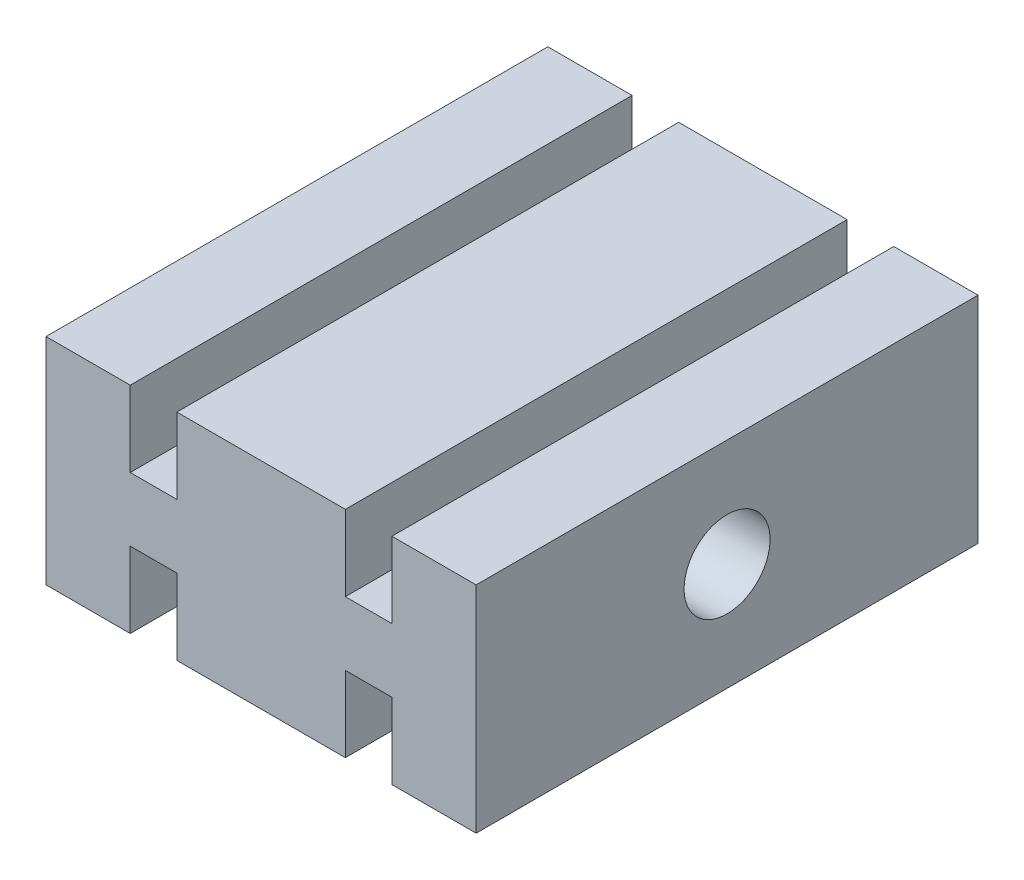
ISO-10303-21;
HEADER;
FILE_DESCRIPTION(('STEP AP214'),'2;1');
FILE_NAME('part.step','',(''),(''),'','','');
FILE_SCHEMA(('AUTOMOTIVE_DESIGN { 1 0 10303 214 1 1 1 1 }'));
ENDSEC;
DATA;
#1=APPLICATION_CONTEXT('core data for automotive mechanical design processes');
#2=APPLICATION_PROTOCOL_DEFINITION('international standard','automotive_design',2000,#1);
#3=PRODUCT_CONTEXT('',#1,'mechanical');
#4=PRODUCT('Part','Part','',(#3));
#5=PRODUCT_RELATED_PRODUCT_CATEGORY('part','',(#4));
#6=PRODUCT_DEFINITION_FORMATION('','',#4);
#7=PRODUCT_DEFINITION_CONTEXT('part definition',#1,'design');
#8=PRODUCT_DEFINITION('design','',#6,#7);
#9=PRODUCT_DEFINITION_SHAPE('','',#8);
#10=(LENGTH_UNIT() NAMED_UNIT(*) SI_UNIT(.MILLI.,.METRE.));
#11=(NAMED_UNIT(*) PLANE_ANGLE_UNIT() SI_UNIT($,.RADIAN.));
#12=(NAMED_UNIT(*) SI_UNIT($,.STERADIAN.) SOLID_ANGLE_UNIT());
#13=UNCERTAINTY_MEASURE_WITH_UNIT(LENGTH_MEASURE(1.E-05),#10,'distance_accuracy_value','');
#14=(GEOMETRIC_REPRESENTATION_CONTEXT(3) GLOBAL_UNCERTAINTY_ASSIGNED_CONTEXT((#13)) GLOBAL_UNIT_ASSIGNED_CONTEXT((#10,
#11,#12)) REPRESENTATION_CONTEXT('',''));
#15=CARTESIAN_POINT('',(0.,0.,0.));
#16=DIRECTION('',(0.,0.,1.));
#17=DIRECTION('',(1.,0.,0.));
#18=AXIS2_PLACEMENT_3D('',#15,#16,#17);
#19=CARTESIAN_POINT('',(11.75,4.45,-35.));
#20=DIRECTION('',(0.,-1.,0.));
#21=DIRECTION('',(0.,0.,-1.));
#22=AXIS2_PLACEMENT_3D('',#19,#20,#21);
#23=PLANE('',#22);
#24=DIRECTION('',(0.,0.,1.));
#25=VECTOR('',#24,1.);
#26=CARTESIAN_POINT('',(18.25,4.45,-35.));
#27=LINE('',#26,#25);
#28=CARTESIAN_POINT('',(18.25,4.45,4.02461178252015));
#29=VERTEX_POINT('',#28);
#30=CARTESIAN_POINT('',(18.25,4.45,35.));
#31=VERTEX_POINT('',#30);
#32=EDGE_CURVE('E301',#29,#31,#27,.T.);
#33=ORIENTED_EDGE('',*,*,#32,.F.);
#34=DIRECTION('',(-1.,0.,0.));
#35=VECTOR('',#34,1.);
#36=CARTESIAN_POINT('',(30.,4.45,4.02461178252015));
#37=LINE('',#36,#35);
#38=CARTESIAN_POINT('',(11.75,4.45,4.02461178252015));
#39=VERTEX_POINT('',#38);
#40=EDGE_CURVE('E390',#29,#39,#37,.T.);
#41=ORIENTED_EDGE('',*,*,#40,.T.);
#42=DIRECTION('',(0.,0.,1.));
#43=VECTOR('',#42,1.);
#44=CARTESIAN_POINT('',(11.75,4.45,-35.));
#45=LINE('',#44,#43);
#46=CARTESIAN_POINT('',(11.75,4.45,35.));
#47=VERTEX_POINT('',#46);
#48=EDGE_CURVE('E288',#39,#47,#45,.T.);
#49=ORIENTED_EDGE('',*,*,#48,.T.);
#50=DIRECTION('',(1.,0.,0.));
#51=VECTOR('',#50,1.);
#52=CARTESIAN_POINT('',(11.75,4.45,35.));
#53=LINE('',#52,#51);
#54=EDGE_CURVE('E268',#47,#31,#53,.T.);
#55=ORIENTED_EDGE('',*,*,#54,.T.);
#56=EDGE_LOOP('',(#33,#41,#49,#55));
#57=FACE_BOUND('',#56,.T.);
#58=ADVANCED_FACE('F39',(#57),#23,.F.);
#59=CARTESIAN_POINT('',(-18.25,4.45,-35.));
#60=DIRECTION('',(0.,-1.,0.));
#61=DIRECTION('',(0.,0.,-1.));
#62=AXIS2_PLACEMENT_3D('',#59,#60,#61);
#63=PLANE('',#62);
#64=DIRECTION('',(0.,0.,1.));
#65=VECTOR('',#64,1.);
#66=CARTESIAN_POINT('',(-11.75,4.45,-35.));
#67=LINE('',#66,#65);
#68=CARTESIAN_POINT('',(-11.75,4.45,4.02461178252015));
#69=VERTEX_POINT('',#68);
#70=CARTESIAN_POINT('',(-11.75,4.45,35.));
#71=VERTEX_POINT('',#70);
#72=EDGE_CURVE('E434',#69,#71,#67,.T.);
#73=ORIENTED_EDGE('',*,*,#72,.F.);
#74=DIRECTION('',(-1.,0.,0.));
#75=VECTOR('',#74,1.);
#76=CARTESIAN_POINT('',(30.,4.45,4.02461178252015));
#77=LINE('',#76,#75);
#78=CARTESIAN_POINT('',(-18.25,4.45,4.02461178252015));
#79=VERTEX_POINT('',#78);
#80=EDGE_CURVE('E377',#69,#79,#77,.T.);
#81=ORIENTED_EDGE('',*,*,#80,.T.);
#82=DIRECTION('',(0.,0.,1.));
#83=VECTOR('',#82,1.);
#84=CARTESIAN_POINT('',(-18.25,4.45,-35.));
#85=LINE('',#84,#83);
#86=CARTESIAN_POINT('',(-18.25,4.45,35.));
#87=VERTEX_POINT('',#86);
#88=EDGE_CURVE('E423',#79,#87,#85,.T.);
#89=ORIENTED_EDGE('',*,*,#88,.T.);
#90=DIRECTION('',(1.,0.,0.));
#91=VECTOR('',#90,1.);
#92=CARTESIAN_POINT('',(-18.25,4.45,35.));
#93=LINE('',#92,#91);
#94=EDGE_CURVE('E403',#87,#71,#93,.T.);
#95=ORIENTED_EDGE('',*,*,#94,.T.);
#96=EDGE_LOOP('',(#73,#81,#89,#95));
#97=FACE_BOUND('',#96,.T.);
#98=ADVANCED_FACE('F554',(#97),#63,.F.);
#99=CARTESIAN_POINT('',(-18.25,-4.45,-35.));
#100=DIRECTION('',(0.,1.,0.));
#101=DIRECTION('',(0.,0.,1.));
#102=AXIS2_PLACEMENT_3D('',#99,#100,#101);
#103=PLANE('',#102);
#104=DIRECTION('',(0.,0.,1.));
#105=VECTOR('',#104,1.);
#106=CARTESIAN_POINT('',(-11.75,-4.45,-35.));
#107=LINE('',#106,#105);
#108=CARTESIAN_POINT('',(-11.75,-4.45,-35.));
#109=VERTEX_POINT('',#108);
#110=CARTESIAN_POINT('',(-11.75,-4.45,-4.02461178252015));
#111=VERTEX_POINT('',#110);
#112=EDGE_CURVE('E467',#109,#111,#107,.T.);
#113=ORIENTED_EDGE('',*,*,#112,.T.);
#114=DIRECTION('',(-1.,0.,0.));
#115=VECTOR('',#114,1.);
#116=CARTESIAN_POINT('',(30.,-4.45,-4.02461178252015));
#117=LINE('',#116,#115);
#118=CARTESIAN_POINT('',(-18.25,-4.45,-4.02461178252015));
#119=VERTEX_POINT('',#118);
#120=EDGE_CURVE('E592',#111,#119,#117,.T.);
#121=ORIENTED_EDGE('',*,*,#120,.T.);
#122=DIRECTION('',(0.,0.,1.));
#123=VECTOR('',#122,1.);
#124=CARTESIAN_POINT('',(-18.25,-4.45,-35.));
#125=LINE('',#124,#123);
#126=CARTESIAN_POINT('',(-18.25,-4.45,-35.));
#127=VERTEX_POINT('',#126);
#128=EDGE_CURVE('E404',#127,#119,#125,.T.);
#129=ORIENTED_EDGE('',*,*,#128,.F.);
#130=DIRECTION('',(-1.,0.,0.));
#131=VECTOR('',#130,1.);
#132=CARTESIAN_POINT('',(-18.25,-4.45,-35.));
#133=LINE('',#132,#131);
#134=EDGE_CURVE('E458',#109,#127,#133,.T.);
#135=ORIENTED_EDGE('',*,*,#134,.F.);
#136=EDGE_LOOP('',(#113,#121,#129,#135));
#137=FACE_BOUND('',#136,.T.);
#138=ADVANCED_FACE('F578',(#137),#103,.F.);
#139=CARTESIAN_POINT('',(11.75,-4.45,-35.));
#140=DIRECTION('',(0.,1.,0.));
#141=DIRECTION('',(0.,0.,1.));
#142=AXIS2_PLACEMENT_3D('',#139,#140,#141);
#143=PLANE('',#142);
#144=DIRECTION('',(0.,0.,1.));
#145=VECTOR('',#144,1.);
#146=CARTESIAN_POINT('',(18.25,-4.45,-35.));
#147=LINE('',#146,#145);
#148=CARTESIAN_POINT('',(18.25,-4.45,-35.));
#149=VERTEX_POINT('',#148);
#150=CARTESIAN_POINT('',(18.25,-4.45,-4.02461178252015));
#151=VERTEX_POINT('',#150);
#152=EDGE_CURVE('E249',#149,#151,#147,.T.);
#153=ORIENTED_EDGE('',*,*,#152,.T.);
#154=DIRECTION('',(-1.,0.,0.));
#155=VECTOR('',#154,1.);
#156=CARTESIAN_POINT('',(30.,-4.45,-4.02461178252015));
#157=LINE('',#156,#155);
#158=CARTESIAN_POINT('',(11.75,-4.45,-4.02461178252015));
#159=VERTEX_POINT('',#158);
#160=EDGE_CURVE('E229',#151,#159,#157,.T.);
#161=ORIENTED_EDGE('',*,*,#160,.T.);
#162=DIRECTION('',(0.,0.,1.));
#163=VECTOR('',#162,1.);
#164=CARTESIAN_POINT('',(11.75,-4.45,-35.));
#165=LINE('',#164,#163);
#166=CARTESIAN_POINT('',(11.75,-4.45,-35.));
#167=VERTEX_POINT('',#166);
#168=EDGE_CURVE('E257',#167,#159,#165,.T.);
#169=ORIENTED_EDGE('',*,*,#168,.F.);
#170=DIRECTION('',(-1.,0.,0.));
#171=VECTOR('',#170,1.);
#172=CARTESIAN_POINT('',(11.75,-4.45,-35.));
#173=LINE('',#172,#171);
#174=EDGE_CURVE('E263',#149,#167,#173,.T.);
#175=ORIENTED_EDGE('',*,*,#174,.F.);
#176=EDGE_LOOP('',(#153,#161,#169,#175));
#177=FACE_BOUND('',#176,.T.);
#178=ADVANCED_FACE('F496',(#177),#143,.F.);
#179=CARTESIAN_POINT('',(-30.,15.,35.));
#180=DIRECTION('',(0.,-1.,0.));
#181=DIRECTION('',(0.,0.,-1.));
#182=AXIS2_PLACEMENT_3D('',#179,#180,#181);
#183=PLANE('',#182);
#184=DIRECTION('',(-1.,0.,0.));
#185=VECTOR('',#184,1.);
#186=CARTESIAN_POINT('',(-30.,15.,35.));
#187=LINE('',#186,#185);
#188=CARTESIAN_POINT('',(-18.25,15.,35.));
#189=VERTEX_POINT('',#188);
#190=CARTESIAN_POINT('',(-30.,15.,35.));
#191=VERTEX_POINT('',#190);
#192=EDGE_CURVE('E310',#189,#191,#187,.T.);
#193=ORIENTED_EDGE('',*,*,#192,.F.);
#194=DIRECTION('',(0.,0.,1.));
#195=VECTOR('',#194,1.);
#196=CARTESIAN_POINT('',(-18.25,15.,-35.));
#197=LINE('',#196,#195);
#198=CARTESIAN_POINT('',(-18.25,15.,-35.));
#199=VERTEX_POINT('',#198);
#200=EDGE_CURVE('E269',#199,#189,#197,.T.);
#201=ORIENTED_EDGE('',*,*,#200,.F.);
#202=DIRECTION('',(-1.,0.,0.));
#203=VECTOR('',#202,1.);
#204=CARTESIAN_POINT('',(-30.,15.,-35.));
#205=LINE('',#204,#203);
#206=CARTESIAN_POINT('',(-30.,15.,-35.));
#207=VERTEX_POINT('',#206);
#208=EDGE_CURVE('E330',#199,#207,#205,.T.);
#209=ORIENTED_EDGE('',*,*,#208,.T.);
#210=DIRECTION('',(0.,0.,-1.));
#211=VECTOR('',#210,1.);
#212=CARTESIAN_POINT('',(-30.,15.,35.));
#213=LINE('',#212,#211);
#214=EDGE_CURVE('E351',#191,#207,#213,.T.);
#215=ORIENTED_EDGE('',*,*,#214,.F.);
#216=EDGE_LOOP('',(#193,#201,#209,#215));
#217=FACE_BOUND('',#216,.T.);
#218=ADVANCED_FACE('F562',(#217),#183,.F.);
#219=CARTESIAN_POINT('',(11.75,15.,-35.));
#220=VERTEX_POINT('',#219);
#221=CARTESIAN_POINT('',(-11.75,15.,-35.));
#222=VERTEX_POINT('',#221);
#223=EDGE_CURVE('E336',#220,#222,#205,.T.);
#224=ORIENTED_EDGE('',*,*,#223,.T.);
#225=DIRECTION('',(0.,0.,1.));
#226=VECTOR('',#225,1.);
#227=CARTESIAN_POINT('',(-11.75,15.,-35.));
#228=LINE('',#227,#226);
#229=CARTESIAN_POINT('',(-11.75,15.,35.));
#230=VERTEX_POINT('',#229);
#231=EDGE_CURVE('E426',#222,#230,#228,.T.);
#232=ORIENTED_EDGE('',*,*,#231,.T.);
#233=CARTESIAN_POINT('',(11.75,15.,35.));
#234=VERTEX_POINT('',#233);
#235=EDGE_CURVE('E317',#234,#230,#187,.T.);
#236=ORIENTED_EDGE('',*,*,#235,.F.);
#237=DIRECTION('',(0.,0.,1.));
#238=VECTOR('',#237,1.);
#239=CARTESIAN_POINT('',(11.75,15.,-35.));
#240=LINE('',#239,#238);
#241=EDGE_CURVE('E289',#220,#234,#240,.T.);
#242=ORIENTED_EDGE('',*,*,#241,.F.);
#243=EDGE_LOOP('',(#224,#232,#236,#242));
#244=FACE_BOUND('',#243,.T.);
#245=ADVANCED_FACE('F540',(#244),#183,.F.);
#246=CARTESIAN_POINT('',(-30.,-15.,35.));
#247=DIRECTION('',(0.,1.,0.));
#248=DIRECTION('',(0.,0.,1.));
#249=AXIS2_PLACEMENT_3D('',#246,#247,#248);
#250=PLANE('',#249);
#251=DIRECTION('',(1.,0.,0.));
#252=VECTOR('',#251,1.);
#253=CARTESIAN_POINT('',(-30.,-15.,-35.));
#254=LINE('',#253,#252);
#255=CARTESIAN_POINT('',(-11.75,-15.,-35.));
#256=VERTEX_POINT('',#255);
#257=CARTESIAN_POINT('',(11.75,-15.,-35.));
#258=VERTEX_POINT('',#257);
#259=EDGE_CURVE('E343',#256,#258,#254,.T.);
#260=ORIENTED_EDGE('',*,*,#259,.T.);
#261=DIRECTION('',(0.,0.,1.));
#262=VECTOR('',#261,1.);
#263=CARTESIAN_POINT('',(11.75,-15.,-35.));
#264=LINE('',#263,#262);
#265=CARTESIAN_POINT('',(11.75,-15.,35.));
#266=VERTEX_POINT('',#265);
#267=EDGE_CURVE('E254',#258,#266,#264,.T.);
#268=ORIENTED_EDGE('',*,*,#267,.T.);
#269=DIRECTION('',(1.,0.,0.));
#270=VECTOR('',#269,1.);
#271=CARTESIAN_POINT('',(-30.,-15.,35.));
#272=LINE('',#271,#270);
#273=CARTESIAN_POINT('',(-11.75,-15.,35.));
#274=VERTEX_POINT('',#273);
#275=EDGE_CURVE('E326',#274,#266,#272,.T.);
#276=ORIENTED_EDGE('',*,*,#275,.F.);
#277=DIRECTION('',(0.,0.,1.));
#278=VECTOR('',#277,1.);
#279=CARTESIAN_POINT('',(-11.75,-15.,-35.));
#280=LINE('',#279,#278);
#281=EDGE_CURVE('E472',#256,#274,#280,.T.);
#282=ORIENTED_EDGE('',*,*,#281,.F.);
#283=EDGE_LOOP('',(#260,#268,#276,#282));
#284=FACE_BOUND('',#283,.T.);
#285=ADVANCED_FACE('F513',(#284),#250,.F.);
#286=CARTESIAN_POINT('',(-30.,-15.,-35.));
#287=VERTEX_POINT('',#286);
#288=CARTESIAN_POINT('',(-18.25,-15.,-35.));
#289=VERTEX_POINT('',#288);
#290=EDGE_CURVE('E311',#287,#289,#254,.T.);
#291=ORIENTED_EDGE('',*,*,#290,.T.);
#292=DIRECTION('',(0.,0.,1.));
#293=VECTOR('',#292,1.);
#294=CARTESIAN_POINT('',(-18.25,-15.,-35.));
#295=LINE('',#294,#293);
#296=CARTESIAN_POINT('',(-18.25,-15.,35.));
#297=VERTEX_POINT('',#296);
#298=EDGE_CURVE('E462',#289,#297,#295,.T.);
#299=ORIENTED_EDGE('',*,*,#298,.T.);
#300=CARTESIAN_POINT('',(-30.,-15.,35.));
#301=VERTEX_POINT('',#300);
#302=EDGE_CURVE('E321',#301,#297,#272,.T.);
#303=ORIENTED_EDGE('',*,*,#302,.F.);
#304=DIRECTION('',(0.,0.,-1.));
#305=VECTOR('',#304,1.);
#306=CARTESIAN_POINT('',(-30.,-15.,35.));
#307=LINE('',#306,#305);
#308=EDGE_CURVE('E347',#301,#287,#307,.T.);
#309=ORIENTED_EDGE('',*,*,#308,.T.);
#310=EDGE_LOOP('',(#291,#299,#303,#309));
#311=FACE_BOUND('',#310,.T.);
#312=ADVANCED_FACE('F571',(#311),#250,.F.);
#313=CARTESIAN_POINT('',(30.,-15.,35.));
#314=DIRECTION('',(-1.,0.,0.));
#315=DIRECTION('',(0.,0.,1.));
#316=AXIS2_PLACEMENT_3D('',#313,#314,#315);
#317=PLANE('',#316);
#318=CARTESIAN_POINT('',(30.,0.,0.));
#319=DIRECTION('',(-1.,0.,0.));
#320=DIRECTION('',(0.,0.,1.));
#321=AXIS2_PLACEMENT_3D('',#318,#319,#320);
#322=CIRCLE('',#321,6.);
#323=CARTESIAN_POINT('',(30.,0.,6.));
#324=VERTEX_POINT('',#323);
#325=EDGE_CURVE('E242',#324,#324,#322,.T.);
#326=ORIENTED_EDGE('',*,*,#325,.T.);
#327=EDGE_LOOP('',(#326));
#328=FACE_BOUND('',#327,.T.);
#329=DIRECTION('',(0.,1.,0.));
#330=VECTOR('',#329,1.);
#331=CARTESIAN_POINT('',(30.,-15.,-35.));
#332=LINE('',#331,#330);
#333=CARTESIAN_POINT('',(30.,-15.,-35.));
#334=VERTEX_POINT('',#333);
#335=CARTESIAN_POINT('',(30.,15.,-35.));
#336=VERTEX_POINT('',#335);
#337=EDGE_CURVE('E292',#334,#336,#332,.T.);
#338=ORIENTED_EDGE('',*,*,#337,.T.);
#339=DIRECTION('',(0.,0.,-1.));
#340=VECTOR('',#339,1.);
#341=CARTESIAN_POINT('',(30.,15.,35.));
#342=LINE('',#341,#340);
#343=CARTESIAN_POINT('',(30.,15.,35.));
#344=VERTEX_POINT('',#343);
#345=EDGE_CURVE('E48',#344,#336,#342,.T.);
#346=ORIENTED_EDGE('',*,*,#345,.F.);
#347=DIRECTION('',(0.,1.,0.));
#348=VECTOR('',#347,1.);
#349=CARTESIAN_POINT('',(30.,-15.,35.));
#350=LINE('',#349,#348);
#351=CARTESIAN_POINT('',(30.,-15.,35.));
#352=VERTEX_POINT('',#351);
#353=EDGE_CURVE('E306',#352,#344,#350,.T.);
#354=ORIENTED_EDGE('',*,*,#353,.F.);
#355=DIRECTION('',(0.,0.,-1.));
#356=VECTOR('',#355,1.);
#357=CARTESIAN_POINT('',(30.,-15.,35.));
#358=LINE('',#357,#356);
#359=EDGE_CURVE('E325',#352,#334,#358,.T.);
#360=ORIENTED_EDGE('',*,*,#359,.T.);
#361=EDGE_LOOP('',(#338,#346,#354,#360));
#362=FACE_BOUND('',#361,.T.);
#363=ADVANCED_FACE('F41',(#328,#362),#317,.F.);
#364=CARTESIAN_POINT('',(18.25,15.,-35.));
#365=VERTEX_POINT('',#364);
#366=EDGE_CURVE('E331',#336,#365,#205,.T.);
#367=ORIENTED_EDGE('',*,*,#366,.T.);
#368=DIRECTION('',(0.,0.,1.));
#369=VECTOR('',#368,1.);
#370=CARTESIAN_POINT('',(18.25,15.,-35.));
#371=LINE('',#370,#369);
#372=CARTESIAN_POINT('',(18.25,15.,35.));
#373=VERTEX_POINT('',#372);
#374=EDGE_CURVE('E293',#365,#373,#371,.T.);
#375=ORIENTED_EDGE('',*,*,#374,.T.);
#376=EDGE_CURVE('E312',#344,#373,#187,.T.);
#377=ORIENTED_EDGE('',*,*,#376,.F.);
#378=ORIENTED_EDGE('',*,*,#345,.T.);
#379=EDGE_LOOP('',(#367,#375,#377,#378));
#380=FACE_BOUND('',#379,.T.);
#381=ADVANCED_FACE('F358',(#380),#183,.F.);
#382=CARTESIAN_POINT('',(-30.,-15.,35.));
#383=DIRECTION('',(1.,0.,0.));
#384=DIRECTION('',(0.,0.,-1.));
#385=AXIS2_PLACEMENT_3D('',#382,#383,#384);
#386=PLANE('',#385);
#387=CARTESIAN_POINT('',(-30.,0.,0.));
#388=DIRECTION('',(1.,0.,0.));
#389=DIRECTION('',(0.,0.,-1.));
#390=AXIS2_PLACEMENT_3D('',#387,#388,#389);
#391=CIRCLE('',#390,6.);
#392=CARTESIAN_POINT('',(-30.,0.,-6.));
#393=VERTEX_POINT('',#392);
#394=EDGE_CURVE('E394',#393,#393,#391,.T.);
#395=ORIENTED_EDGE('',*,*,#394,.T.);
#396=EDGE_LOOP('',(#395));
#397=FACE_BOUND('',#396,.T.);
#398=DIRECTION('',(0.,-1.,0.));
#399=VECTOR('',#398,1.);
#400=CARTESIAN_POINT('',(-30.,-15.,-35.));
#401=LINE('',#400,#399);
#402=EDGE_CURVE('E335',#207,#287,#401,.T.);
#403=ORIENTED_EDGE('',*,*,#402,.T.);
#404=ORIENTED_EDGE('',*,*,#308,.F.);
#405=DIRECTION('',(0.,-1.,0.));
#406=VECTOR('',#405,1.);
#407=CARTESIAN_POINT('',(-30.,-15.,35.));
#408=LINE('',#407,#406);
#409=EDGE_CURVE('E316',#191,#301,#408,.T.);
#410=ORIENTED_EDGE('',*,*,#409,.F.);
#411=ORIENTED_EDGE('',*,*,#214,.T.);
#412=EDGE_LOOP('',(#403,#404,#410,#411));
#413=FACE_BOUND('',#412,.T.);
#414=ADVANCED_FACE('F567',(#397,#413),#386,.F.);
#415=CARTESIAN_POINT('',(18.25,-15.,35.));
#416=VERTEX_POINT('',#415);
#417=EDGE_CURVE('E320',#416,#352,#272,.T.);
#418=ORIENTED_EDGE('',*,*,#417,.F.);
#419=DIRECTION('',(0.,0.,1.));
#420=VECTOR('',#419,1.);
#421=CARTESIAN_POINT('',(18.25,-15.,-35.));
#422=LINE('',#421,#420);
#423=CARTESIAN_POINT('',(18.25,-15.,-35.));
#424=VERTEX_POINT('',#423);
#425=EDGE_CURVE('E250',#424,#416,#422,.T.);
#426=ORIENTED_EDGE('',*,*,#425,.F.);
#427=EDGE_CURVE('E339',#424,#334,#254,.T.);
#428=ORIENTED_EDGE('',*,*,#427,.T.);
#429=ORIENTED_EDGE('',*,*,#359,.F.);
#430=EDGE_LOOP('',(#418,#426,#428,#429));
#431=FACE_BOUND('',#430,.T.);
#432=ADVANCED_FACE('F501',(#431),#250,.F.);
#433=CARTESIAN_POINT('',(0.,0.,35.));
#434=DIRECTION('',(0.,0.,-1.));
#435=DIRECTION('',(-1.,0.,0.));
#436=AXIS2_PLACEMENT_3D('',#433,#434,#435);
#437=PLANE('',#436);
#438=ORIENTED_EDGE('',*,*,#275,.T.);
#439=DIRECTION('',(0.,-1.,0.));
#440=VECTOR('',#439,1.);
#441=CARTESIAN_POINT('',(11.75,-15.,35.));
#442=LINE('',#441,#440);
#443=CARTESIAN_POINT('',(11.75,-4.45,35.));
#444=VERTEX_POINT('',#443);
#445=EDGE_CURVE('E398',#444,#266,#442,.T.);
#446=ORIENTED_EDGE('',*,*,#445,.F.);
#447=DIRECTION('',(-1.,0.,0.));
#448=VECTOR('',#447,1.);
#449=CARTESIAN_POINT('',(11.75,-4.45,35.));
#450=LINE('',#449,#448);
#451=CARTESIAN_POINT('',(18.25,-4.45,35.));
#452=VERTEX_POINT('',#451);
#453=EDGE_CURVE('E482',#452,#444,#450,.T.);
#454=ORIENTED_EDGE('',*,*,#453,.F.);
#455=DIRECTION('',(0.,1.,0.));
#456=VECTOR('',#455,1.);
#457=CARTESIAN_POINT('',(18.25,-15.,35.));
#458=LINE('',#457,#456);
#459=EDGE_CURVE('E246',#416,#452,#458,.T.);
#460=ORIENTED_EDGE('',*,*,#459,.F.);
#461=ORIENTED_EDGE('',*,*,#417,.T.);
#462=ORIENTED_EDGE('',*,*,#353,.T.);
#463=ORIENTED_EDGE('',*,*,#376,.T.);
#464=DIRECTION('',(0.,1.,0.));
#465=VECTOR('',#464,1.);
#466=CARTESIAN_POINT('',(18.25,15.,35.));
#467=LINE('',#466,#465);
#468=EDGE_CURVE('E273',#31,#373,#467,.T.);
#469=ORIENTED_EDGE('',*,*,#468,.F.);
#470=ORIENTED_EDGE('',*,*,#54,.F.);
#471=DIRECTION('',(0.,-1.,0.));
#472=VECTOR('',#471,1.);
#473=CARTESIAN_POINT('',(11.75,15.,35.));
#474=LINE('',#473,#472);
#475=EDGE_CURVE('E264',#234,#47,#474,.T.);
#476=ORIENTED_EDGE('',*,*,#475,.F.);
#477=ORIENTED_EDGE('',*,*,#235,.T.);
#478=DIRECTION('',(0.,1.,0.));
#479=VECTOR('',#478,1.);
#480=CARTESIAN_POINT('',(-11.75,15.,35.));
#481=LINE('',#480,#479);
#482=EDGE_CURVE('E408',#71,#230,#481,.T.);
#483=ORIENTED_EDGE('',*,*,#482,.F.);
#484=ORIENTED_EDGE('',*,*,#94,.F.);
#485=DIRECTION('',(0.,-1.,0.));
#486=VECTOR('',#485,1.);
#487=CARTESIAN_POINT('',(-18.25,15.,35.));
#488=LINE('',#487,#486);
#489=EDGE_CURVE('E399',#189,#87,#488,.T.);
#490=ORIENTED_EDGE('',*,*,#489,.F.);
#491=ORIENTED_EDGE('',*,*,#192,.T.);
#492=ORIENTED_EDGE('',*,*,#409,.T.);
#493=ORIENTED_EDGE('',*,*,#302,.T.);
#494=DIRECTION('',(0.,-1.,0.));
#495=VECTOR('',#494,1.);
#496=CARTESIAN_POINT('',(-18.25,-15.,35.));
#497=LINE('',#496,#495);
#498=CARTESIAN_POINT('',(-18.25,-4.45,35.));
#499=VERTEX_POINT('',#498);
#500=EDGE_CURVE('E439',#499,#297,#497,.T.);
#501=ORIENTED_EDGE('',*,*,#500,.F.);
#502=DIRECTION('',(-1.,0.,0.));
#503=VECTOR('',#502,1.);
#504=CARTESIAN_POINT('',(-18.25,-4.45,35.));
#505=LINE('',#504,#503);
#506=CARTESIAN_POINT('',(-11.75,-4.45,35.));
#507=VERTEX_POINT('',#506);
#508=EDGE_CURVE('E446',#507,#499,#505,.T.);
#509=ORIENTED_EDGE('',*,*,#508,.F.);
#510=DIRECTION('',(0.,1.,0.));
#511=VECTOR('',#510,1.);
#512=CARTESIAN_POINT('',(-11.75,-15.,35.));
#513=LINE('',#512,#511);
#514=EDGE_CURVE('E442',#274,#507,#513,.T.);
#515=ORIENTED_EDGE('',*,*,#514,.F.);
#516=EDGE_LOOP('',(#438,#446,#454,#460,#461,#462,#463,#469,#470,#476,#477,#483,#484,#490,#491,
#492,#493,#501,#509,#515));
#517=FACE_BOUND('',#516,.T.);
#518=ADVANCED_FACE('F509',(#517),#437,.F.);
#519=CARTESIAN_POINT('',(0.,0.,-35.));
#520=DIRECTION('',(0.,0.,-1.));
#521=DIRECTION('',(-1.,0.,0.));
#522=AXIS2_PLACEMENT_3D('',#519,#520,#521);
#523=PLANE('',#522);
#524=DIRECTION('',(0.,-1.,0.));
#525=VECTOR('',#524,1.);
#526=CARTESIAN_POINT('',(11.75,-15.,-35.));
#527=LINE('',#526,#525);
#528=EDGE_CURVE('E485',#167,#258,#527,.T.);
#529=ORIENTED_EDGE('',*,*,#528,.T.);
#530=ORIENTED_EDGE('',*,*,#259,.F.);
#531=DIRECTION('',(0.,1.,0.));
#532=VECTOR('',#531,1.);
#533=CARTESIAN_POINT('',(-11.75,-15.,-35.));
#534=LINE('',#533,#532);
#535=EDGE_CURVE('E454',#256,#109,#534,.T.);
#536=ORIENTED_EDGE('',*,*,#535,.T.);
#537=ORIENTED_EDGE('',*,*,#134,.T.);
#538=DIRECTION('',(0.,-1.,0.));
#539=VECTOR('',#538,1.);
#540=CARTESIAN_POINT('',(-18.25,-15.,-35.));
#541=LINE('',#540,#539);
#542=EDGE_CURVE('E450',#127,#289,#541,.T.);
#543=ORIENTED_EDGE('',*,*,#542,.T.);
#544=ORIENTED_EDGE('',*,*,#290,.F.);
#545=ORIENTED_EDGE('',*,*,#402,.F.);
#546=ORIENTED_EDGE('',*,*,#208,.F.);
#547=DIRECTION('',(0.,-1.,0.));
#548=VECTOR('',#547,1.);
#549=CARTESIAN_POINT('',(-18.25,15.,-35.));
#550=LINE('',#549,#548);
#551=CARTESIAN_POINT('',(-18.25,4.45,-35.));
#552=VERTEX_POINT('',#551);
#553=EDGE_CURVE('E411',#199,#552,#550,.T.);
#554=ORIENTED_EDGE('',*,*,#553,.T.);
#555=DIRECTION('',(1.,0.,0.));
#556=VECTOR('',#555,1.);
#557=CARTESIAN_POINT('',(-18.25,4.45,-35.));
#558=LINE('',#557,#556);
#559=CARTESIAN_POINT('',(-11.75,4.45,-35.));
#560=VERTEX_POINT('',#559);
#561=EDGE_CURVE('E415',#552,#560,#558,.T.);
#562=ORIENTED_EDGE('',*,*,#561,.T.);
#563=DIRECTION('',(0.,1.,0.));
#564=VECTOR('',#563,1.);
#565=CARTESIAN_POINT('',(-11.75,15.,-35.));
#566=LINE('',#565,#564);
#567=EDGE_CURVE('E419',#560,#222,#566,.T.);
#568=ORIENTED_EDGE('',*,*,#567,.T.);
#569=ORIENTED_EDGE('',*,*,#223,.F.);
#570=DIRECTION('',(0.,-1.,0.));
#571=VECTOR('',#570,1.);
#572=CARTESIAN_POINT('',(11.75,15.,-35.));
#573=LINE('',#572,#571);
#574=CARTESIAN_POINT('',(11.75,4.45,-35.));
#575=VERTEX_POINT('',#574);
#576=EDGE_CURVE('E276',#220,#575,#573,.T.);
#577=ORIENTED_EDGE('',*,*,#576,.T.);
#578=DIRECTION('',(1.,0.,0.));
#579=VECTOR('',#578,1.);
#580=CARTESIAN_POINT('',(11.75,4.45,-35.));
#581=LINE('',#580,#579);
#582=CARTESIAN_POINT('',(18.25,4.45,-35.));
#583=VERTEX_POINT('',#582);
#584=EDGE_CURVE('E280',#575,#583,#581,.T.);
#585=ORIENTED_EDGE('',*,*,#584,.T.);
#586=DIRECTION('',(0.,1.,0.));
#587=VECTOR('',#586,1.);
#588=CARTESIAN_POINT('',(18.25,15.,-35.));
#589=LINE('',#588,#587);
#590=EDGE_CURVE('E284',#583,#365,#589,.T.);
#591=ORIENTED_EDGE('',*,*,#590,.T.);
#592=ORIENTED_EDGE('',*,*,#366,.F.);
#593=ORIENTED_EDGE('',*,*,#337,.F.);
#594=ORIENTED_EDGE('',*,*,#427,.F.);
#595=DIRECTION('',(0.,1.,0.));
#596=VECTOR('',#595,1.);
#597=CARTESIAN_POINT('',(18.25,-15.,-35.));
#598=LINE('',#597,#596);
#599=EDGE_CURVE('E488',#424,#149,#598,.T.);
#600=ORIENTED_EDGE('',*,*,#599,.T.);
#601=ORIENTED_EDGE('',*,*,#174,.T.);
#602=EDGE_LOOP('',(#529,#530,#536,#537,#543,#544,#545,#546,#554,#562,#568,#569,#577,#585,#591,
#592,#593,#594,#600,#601));
#603=FACE_BOUND('',#602,.T.);
#604=ADVANCED_FACE('F366',(#603),#523,.T.);
#605=CARTESIAN_POINT('',(11.75,15.,-35.));
#606=DIRECTION('',(-1.,0.,0.));
#607=DIRECTION('',(0.,0.,1.));
#608=AXIS2_PLACEMENT_3D('',#605,#606,#607);
#609=PLANE('',#608);
#610=ORIENTED_EDGE('',*,*,#48,.F.);
#611=CARTESIAN_POINT('',(11.75,0.,0.));
#612=DIRECTION('',(-1.,0.,0.));
#613=DIRECTION('',(0.,0.,1.));
#614=AXIS2_PLACEMENT_3D('',#611,#612,#613);
#615=CIRCLE('',#614,6.);
#616=CARTESIAN_POINT('',(11.75,4.45,-4.02461178252015));
#617=VERTEX_POINT('',#616);
#618=EDGE_CURVE('E381',#39,#617,#615,.T.);
#619=ORIENTED_EDGE('',*,*,#618,.T.);
#620=EDGE_CURVE('E302',#575,#617,#45,.T.);
#621=ORIENTED_EDGE('',*,*,#620,.F.);
#622=ORIENTED_EDGE('',*,*,#576,.F.);
#623=ORIENTED_EDGE('',*,*,#241,.T.);
#624=ORIENTED_EDGE('',*,*,#475,.T.);
#625=EDGE_LOOP('',(#610,#619,#621,#622,#623,#624));
#626=FACE_BOUND('',#625,.T.);
#627=ADVANCED_FACE('F637',(#626),#609,.F.);
#628=CARTESIAN_POINT('',(18.25,15.,-35.));
#629=DIRECTION('',(1.,0.,0.));
#630=DIRECTION('',(0.,0.,-1.));
#631=AXIS2_PLACEMENT_3D('',#628,#629,#630);
#632=PLANE('',#631);
#633=CARTESIAN_POINT('',(18.25,4.45,-4.02461178252015));
#634=VERTEX_POINT('',#633);
#635=EDGE_CURVE('E297',#583,#634,#27,.T.);
#636=ORIENTED_EDGE('',*,*,#635,.T.);
#637=CARTESIAN_POINT('',(18.25,0.,0.));
#638=DIRECTION('',(1.,0.,0.));
#639=DIRECTION('',(0.,0.,-1.));
#640=AXIS2_PLACEMENT_3D('',#637,#638,#639);
#641=CIRCLE('',#640,6.);
#642=EDGE_CURVE('E55',#634,#29,#641,.T.);
#643=ORIENTED_EDGE('',*,*,#642,.T.);
#644=ORIENTED_EDGE('',*,*,#32,.T.);
#645=ORIENTED_EDGE('',*,*,#468,.T.);
#646=ORIENTED_EDGE('',*,*,#374,.F.);
#647=ORIENTED_EDGE('',*,*,#590,.F.);
#648=EDGE_LOOP('',(#636,#643,#644,#645,#646,#647));
#649=FACE_BOUND('',#648,.T.);
#650=ADVANCED_FACE('F371',(#649),#632,.F.);
#651=ORIENTED_EDGE('',*,*,#620,.T.);
#652=DIRECTION('',(-1.,0.,0.));
#653=VECTOR('',#652,1.);
#654=CARTESIAN_POINT('',(30.,4.45,-4.02461178252015));
#655=LINE('',#654,#653);
#656=EDGE_CURVE('E374',#617,#634,#655,.F.);
#657=ORIENTED_EDGE('',*,*,#656,.T.);
#658=ORIENTED_EDGE('',*,*,#635,.F.);
#659=ORIENTED_EDGE('',*,*,#584,.F.);
#660=EDGE_LOOP('',(#651,#657,#658,#659));
#661=FACE_BOUND('',#660,.T.);
#662=ADVANCED_FACE('F373',(#661),#23,.F.);
#663=CARTESIAN_POINT('',(-18.25,15.,-35.));
#664=DIRECTION('',(-1.,0.,0.));
#665=DIRECTION('',(0.,0.,1.));
#666=AXIS2_PLACEMENT_3D('',#663,#664,#665);
#667=PLANE('',#666);
#668=ORIENTED_EDGE('',*,*,#88,.F.);
#669=CARTESIAN_POINT('',(-18.25,0.,0.));
#670=DIRECTION('',(-1.,0.,0.));
#671=DIRECTION('',(0.,0.,1.));
#672=AXIS2_PLACEMENT_3D('',#669,#670,#671);
#673=CIRCLE('',#672,6.);
#674=CARTESIAN_POINT('',(-18.25,4.45,-4.02461178252015));
#675=VERTEX_POINT('',#674);
#676=EDGE_CURVE('E384',#79,#675,#673,.T.);
#677=ORIENTED_EDGE('',*,*,#676,.T.);
#678=EDGE_CURVE('E435',#552,#675,#85,.T.);
#679=ORIENTED_EDGE('',*,*,#678,.F.);
#680=ORIENTED_EDGE('',*,*,#553,.F.);
#681=ORIENTED_EDGE('',*,*,#200,.T.);
#682=ORIENTED_EDGE('',*,*,#489,.T.);
#683=EDGE_LOOP('',(#668,#677,#679,#680,#681,#682));
#684=FACE_BOUND('',#683,.T.);
#685=ADVANCED_FACE('F606',(#684),#667,.F.);
#686=CARTESIAN_POINT('',(-11.75,15.,-35.));
#687=DIRECTION('',(1.,0.,0.));
#688=DIRECTION('',(0.,0.,-1.));
#689=AXIS2_PLACEMENT_3D('',#686,#687,#688);
#690=PLANE('',#689);
#691=CARTESIAN_POINT('',(-11.75,4.45,-4.02461178252015));
#692=VERTEX_POINT('',#691);
#693=EDGE_CURVE('E430',#560,#692,#67,.T.);
#694=ORIENTED_EDGE('',*,*,#693,.T.);
#695=CARTESIAN_POINT('',(-11.75,0.,0.));
#696=DIRECTION('',(1.,0.,0.));
#697=DIRECTION('',(0.,0.,-1.));
#698=AXIS2_PLACEMENT_3D('',#695,#696,#697);
#699=CIRCLE('',#698,6.);
#700=EDGE_CURVE('E63',#692,#69,#699,.T.);
#701=ORIENTED_EDGE('',*,*,#700,.T.);
#702=ORIENTED_EDGE('',*,*,#72,.T.);
#703=ORIENTED_EDGE('',*,*,#482,.T.);
#704=ORIENTED_EDGE('',*,*,#231,.F.);
#705=ORIENTED_EDGE('',*,*,#567,.F.);
#706=EDGE_LOOP('',(#694,#701,#702,#703,#704,#705));
#707=FACE_BOUND('',#706,.T.);
#708=ADVANCED_FACE('F543',(#707),#690,.F.);
#709=ORIENTED_EDGE('',*,*,#678,.T.);
#710=DIRECTION('',(-1.,0.,0.));
#711=VECTOR('',#710,1.);
#712=CARTESIAN_POINT('',(30.,4.45,-4.02461178252015));
#713=LINE('',#712,#711);
#714=EDGE_CURVE('E549',#675,#692,#713,.F.);
#715=ORIENTED_EDGE('',*,*,#714,.T.);
#716=ORIENTED_EDGE('',*,*,#693,.F.);
#717=ORIENTED_EDGE('',*,*,#561,.F.);
#718=EDGE_LOOP('',(#709,#715,#716,#717));
#719=FACE_BOUND('',#718,.T.);
#720=ADVANCED_FACE('F548',(#719),#63,.F.);
#721=CARTESIAN_POINT('',(-18.25,-15.,-35.));
#722=DIRECTION('',(-1.,0.,0.));
#723=DIRECTION('',(0.,0.,1.));
#724=AXIS2_PLACEMENT_3D('',#721,#722,#723);
#725=PLANE('',#724);
#726=ORIENTED_EDGE('',*,*,#128,.T.);
#727=CARTESIAN_POINT('',(-18.25,0.,0.));
#728=DIRECTION('',(-1.,0.,0.));
#729=DIRECTION('',(0.,0.,1.));
#730=AXIS2_PLACEMENT_3D('',#727,#728,#729);
#731=CIRCLE('',#730,6.);
#732=CARTESIAN_POINT('',(-18.25,-4.45,4.02461178252015));
#733=VERTEX_POINT('',#732);
#734=EDGE_CURVE('E599',#119,#733,#731,.T.);
#735=ORIENTED_EDGE('',*,*,#734,.T.);
#736=EDGE_CURVE('E466',#733,#499,#125,.T.);
#737=ORIENTED_EDGE('',*,*,#736,.T.);
#738=ORIENTED_EDGE('',*,*,#500,.T.);
#739=ORIENTED_EDGE('',*,*,#298,.F.);
#740=ORIENTED_EDGE('',*,*,#542,.F.);
#741=EDGE_LOOP('',(#726,#735,#737,#738,#739,#740));
#742=FACE_BOUND('',#741,.T.);
#743=ADVANCED_FACE('F575',(#742),#725,.F.);
#744=ORIENTED_EDGE('',*,*,#736,.F.);
#745=DIRECTION('',(-1.,0.,0.));
#746=VECTOR('',#745,1.);
#747=CARTESIAN_POINT('',(30.,-4.45,4.02461178252015));
#748=LINE('',#747,#746);
#749=CARTESIAN_POINT('',(-11.75,-4.45,4.02461178252015));
#750=VERTEX_POINT('',#749);
#751=EDGE_CURVE('E588',#733,#750,#748,.F.);
#752=ORIENTED_EDGE('',*,*,#751,.T.);
#753=EDGE_CURVE('E471',#750,#507,#107,.T.);
#754=ORIENTED_EDGE('',*,*,#753,.T.);
#755=ORIENTED_EDGE('',*,*,#508,.T.);
#756=EDGE_LOOP('',(#744,#752,#754,#755));
#757=FACE_BOUND('',#756,.T.);
#758=ADVANCED_FACE('F611',(#757),#103,.F.);
#759=CARTESIAN_POINT('',(-11.75,-15.,-35.));
#760=DIRECTION('',(1.,0.,0.));
#761=DIRECTION('',(0.,0.,-1.));
#762=AXIS2_PLACEMENT_3D('',#759,#760,#761);
#763=PLANE('',#762);
#764=ORIENTED_EDGE('',*,*,#753,.F.);
#765=CARTESIAN_POINT('',(-11.75,0.,0.));
#766=DIRECTION('',(1.,0.,0.));
#767=DIRECTION('',(0.,0.,-1.));
#768=AXIS2_PLACEMENT_3D('',#765,#766,#767);
#769=CIRCLE('',#768,6.);
#770=EDGE_CURVE('E584',#750,#111,#769,.T.);
#771=ORIENTED_EDGE('',*,*,#770,.T.);
#772=ORIENTED_EDGE('',*,*,#112,.F.);
#773=ORIENTED_EDGE('',*,*,#535,.F.);
#774=ORIENTED_EDGE('',*,*,#281,.T.);
#775=ORIENTED_EDGE('',*,*,#514,.T.);
#776=EDGE_LOOP('',(#764,#771,#772,#773,#774,#775));
#777=FACE_BOUND('',#776,.T.);
#778=ADVANCED_FACE('F583',(#777),#763,.F.);
#779=CARTESIAN_POINT('',(11.75,-15.,-35.));
#780=DIRECTION('',(-1.,0.,0.));
#781=DIRECTION('',(0.,0.,1.));
#782=AXIS2_PLACEMENT_3D('',#779,#780,#781);
#783=PLANE('',#782);
#784=ORIENTED_EDGE('',*,*,#168,.T.);
#785=CARTESIAN_POINT('',(11.75,0.,0.));
#786=DIRECTION('',(-1.,0.,0.));
#787=DIRECTION('',(0.,0.,1.));
#788=AXIS2_PLACEMENT_3D('',#785,#786,#787);
#789=CIRCLE('',#788,6.);
#790=CARTESIAN_POINT('',(11.75,-4.45,4.02461178252015));
#791=VERTEX_POINT('',#790);
#792=EDGE_CURVE('E516',#159,#791,#789,.T.);
#793=ORIENTED_EDGE('',*,*,#792,.T.);
#794=EDGE_CURVE('E240',#791,#444,#165,.T.);
#795=ORIENTED_EDGE('',*,*,#794,.T.);
#796=ORIENTED_EDGE('',*,*,#445,.T.);
#797=ORIENTED_EDGE('',*,*,#267,.F.);
#798=ORIENTED_EDGE('',*,*,#528,.F.);
#799=EDGE_LOOP('',(#784,#793,#795,#796,#797,#798));
#800=FACE_BOUND('',#799,.T.);
#801=ADVANCED_FACE('F515',(#800),#783,.F.);
#802=ORIENTED_EDGE('',*,*,#794,.F.);
#803=DIRECTION('',(-1.,0.,0.));
#804=VECTOR('',#803,1.);
#805=CARTESIAN_POINT('',(30.,-4.45,4.02461178252015));
#806=LINE('',#805,#804);
#807=CARTESIAN_POINT('',(18.25,-4.45,4.02461178252015));
#808=VERTEX_POINT('',#807);
#809=EDGE_CURVE('E226',#791,#808,#806,.F.);
#810=ORIENTED_EDGE('',*,*,#809,.T.);
#811=EDGE_CURVE('E238',#808,#452,#147,.T.);
#812=ORIENTED_EDGE('',*,*,#811,.T.);
#813=ORIENTED_EDGE('',*,*,#453,.T.);
#814=EDGE_LOOP('',(#802,#810,#812,#813));
#815=FACE_BOUND('',#814,.T.);
#816=ADVANCED_FACE('F236',(#815),#143,.F.);
#817=CARTESIAN_POINT('',(18.25,-15.,-35.));
#818=DIRECTION('',(1.,0.,0.));
#819=DIRECTION('',(0.,0.,-1.));
#820=AXIS2_PLACEMENT_3D('',#817,#818,#819);
#821=PLANE('',#820);
#822=ORIENTED_EDGE('',*,*,#811,.F.);
#823=CARTESIAN_POINT('',(18.25,0.,0.));
#824=DIRECTION('',(1.,0.,0.));
#825=DIRECTION('',(0.,0.,-1.));
#826=AXIS2_PLACEMENT_3D('',#823,#824,#825);
#827=CIRCLE('',#826,6.);
#828=EDGE_CURVE('E11',#808,#151,#827,.T.);
#829=ORIENTED_EDGE('',*,*,#828,.T.);
#830=ORIENTED_EDGE('',*,*,#152,.F.);
#831=ORIENTED_EDGE('',*,*,#599,.F.);
#832=ORIENTED_EDGE('',*,*,#425,.T.);
#833=ORIENTED_EDGE('',*,*,#459,.T.);
#834=EDGE_LOOP('',(#822,#829,#830,#831,#832,#833));
#835=FACE_BOUND('',#834,.T.);
#836=ADVANCED_FACE('F244',(#835),#821,.F.);
#837=CARTESIAN_POINT('',(30.,0.,0.));
#838=DIRECTION('',(-1.,0.,0.));
#839=DIRECTION('',(0.,0.,1.));
#840=AXIS2_PLACEMENT_3D('',#837,#838,#839);
#841=CYLINDRICAL_SURFACE('',#840,6.);
#842=ORIENTED_EDGE('',*,*,#642,.F.);
#843=ORIENTED_EDGE('',*,*,#656,.F.);
#844=ORIENTED_EDGE('',*,*,#618,.F.);
#845=ORIENTED_EDGE('',*,*,#40,.F.);
#846=EDGE_LOOP('',(#842,#843,#844,#845));
#847=FACE_BOUND('',#846,.T.);
#848=ORIENTED_EDGE('',*,*,#700,.F.);
#849=ORIENTED_EDGE('',*,*,#714,.F.);
#850=ORIENTED_EDGE('',*,*,#676,.F.);
#851=ORIENTED_EDGE('',*,*,#80,.F.);
#852=EDGE_LOOP('',(#848,#849,#850,#851));
#853=FACE_BOUND('',#852,.T.);
#854=ORIENTED_EDGE('',*,*,#120,.F.);
#855=ORIENTED_EDGE('',*,*,#770,.F.);
#856=ORIENTED_EDGE('',*,*,#751,.F.);
#857=ORIENTED_EDGE('',*,*,#734,.F.);
#858=EDGE_LOOP('',(#854,#855,#856,#857));
#859=FACE_BOUND('',#858,.T.);
#860=ORIENTED_EDGE('',*,*,#160,.F.);
#861=ORIENTED_EDGE('',*,*,#828,.F.);
#862=ORIENTED_EDGE('',*,*,#809,.F.);
#863=ORIENTED_EDGE('',*,*,#792,.F.);
#864=EDGE_LOOP('',(#860,#861,#862,#863));
#865=FACE_BOUND('',#864,.T.);
#866=ORIENTED_EDGE('',*,*,#325,.F.);
#867=EDGE_LOOP('',(#866));
#868=FACE_BOUND('',#867,.T.);
#869=ORIENTED_EDGE('',*,*,#394,.F.);
#870=EDGE_LOOP('',(#869));
#871=FACE_BOUND('',#870,.T.);
#872=ADVANCED_FACE('F224',(#847,#853,#859,#865,#868,#871),#841,.F.);
#873=CLOSED_SHELL('',(#58,#98,#138,#178,#218,#245,#285,#312,#363,#381,#414,#432,#518,#604,#627,
#650,#662,#685,#708,#720,#743,#758,#778,#801,#816,#836,#872));
#874=MANIFOLD_SOLID_BREP('B2',#873);
#875=ADVANCED_BREP_SHAPE_REPRESENTATION('',(#18,#874),#14);
#876=SHAPE_DEFINITION_REPRESENTATION(#9,#875);
ENDSEC;
END-ISO-10303-21;
